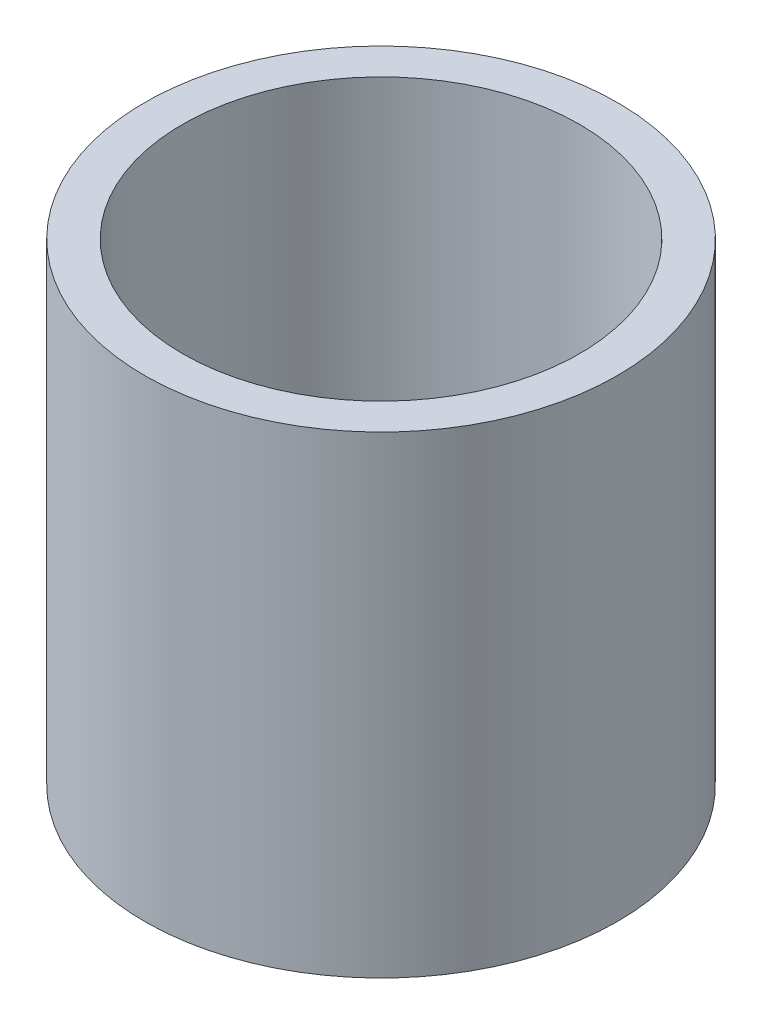
ISO-10303-21;
HEADER;
FILE_DESCRIPTION(('STEP AP214'),'2;1');
FILE_NAME('part.step','',(''),(''),'','','');
FILE_SCHEMA(('AUTOMOTIVE_DESIGN { 1 0 10303 214 1 1 1 1 }'));
ENDSEC;
DATA;
#1=APPLICATION_CONTEXT('core data for automotive mechanical design processes');
#2=APPLICATION_PROTOCOL_DEFINITION('international standard','automotive_design',2000,#1);
#3=PRODUCT_CONTEXT('',#1,'mechanical');
#4=PRODUCT('Part','Part','',(#3));
#5=PRODUCT_RELATED_PRODUCT_CATEGORY('part','',(#4));
#6=PRODUCT_DEFINITION_FORMATION('','',#4);
#7=PRODUCT_DEFINITION_CONTEXT('part definition',#1,'design');
#8=PRODUCT_DEFINITION('design','',#6,#7);
#9=PRODUCT_DEFINITION_SHAPE('','',#8);
#10=(LENGTH_UNIT() NAMED_UNIT(*) SI_UNIT(.MILLI.,.METRE.));
#11=(NAMED_UNIT(*) PLANE_ANGLE_UNIT() SI_UNIT($,.RADIAN.));
#12=(NAMED_UNIT(*) SI_UNIT($,.STERADIAN.) SOLID_ANGLE_UNIT());
#13=UNCERTAINTY_MEASURE_WITH_UNIT(LENGTH_MEASURE(1.E-05),#10,'distance_accuracy_value','');
#14=(GEOMETRIC_REPRESENTATION_CONTEXT(3) GLOBAL_UNCERTAINTY_ASSIGNED_CONTEXT((#13)) GLOBAL_UNIT_ASSIGNED_CONTEXT((#10,
#11,#12)) REPRESENTATION_CONTEXT('',''));
#15=CARTESIAN_POINT('',(0.,0.,0.));
#16=DIRECTION('',(0.,0.,1.));
#17=DIRECTION('',(1.,0.,0.));
#18=AXIS2_PLACEMENT_3D('',#15,#16,#17);
#19=CARTESIAN_POINT('',(0.,50.,0.));
#20=DIRECTION('',(0.,1.,0.));
#21=DIRECTION('',(0.,0.,1.));
#22=AXIS2_PLACEMENT_3D('',#19,#20,#21);
#23=PLANE('',#22);
#24=CARTESIAN_POINT('',(0.,50.,0.));
#25=DIRECTION('',(0.,1.,0.));
#26=DIRECTION('',(1.,0.,0.));
#27=AXIS2_PLACEMENT_3D('',#24,#25,#26);
#28=CIRCLE('',#27,25.);
#29=CARTESIAN_POINT('',(25.,50.,0.));
#30=VERTEX_POINT('',#29);
#31=EDGE_CURVE('E51',#30,#30,#28,.T.);
#32=ORIENTED_EDGE('',*,*,#31,.T.);
#33=EDGE_LOOP('',(#32));
#34=FACE_BOUND('',#33,.T.);
#35=CARTESIAN_POINT('',(0.,50.,0.));
#36=DIRECTION('',(0.,1.,0.));
#37=DIRECTION('',(0.,0.,1.));
#38=AXIS2_PLACEMENT_3D('',#35,#36,#37);
#39=CIRCLE('',#38,21.);
#40=CARTESIAN_POINT('',(0.,50.,21.));
#41=VERTEX_POINT('',#40);
#42=EDGE_CURVE('E62',#41,#41,#39,.T.);
#43=ORIENTED_EDGE('',*,*,#42,.F.);
#44=EDGE_LOOP('',(#43));
#45=FACE_BOUND('',#44,.T.);
#46=ADVANCED_FACE('F43',(#34,#45),#23,.T.);
#47=CARTESIAN_POINT('',(0.,0.,0.));
#48=DIRECTION('',(0.,1.,0.));
#49=DIRECTION('',(0.,0.,1.));
#50=AXIS2_PLACEMENT_3D('',#47,#48,#49);
#51=PLANE('',#50);
#52=CARTESIAN_POINT('',(0.,0.,0.));
#53=DIRECTION('',(0.,1.,0.));
#54=DIRECTION('',(1.,0.,0.));
#55=AXIS2_PLACEMENT_3D('',#52,#53,#54);
#56=CIRCLE('',#55,25.);
#57=CARTESIAN_POINT('',(25.,0.,0.));
#58=VERTEX_POINT('',#57);
#59=EDGE_CURVE('E56',#58,#58,#56,.T.);
#60=ORIENTED_EDGE('',*,*,#59,.F.);
#61=EDGE_LOOP('',(#60));
#62=FACE_BOUND('',#61,.T.);
#63=ADVANCED_FACE('F71',(#62),#51,.F.);
#64=CARTESIAN_POINT('',(0.,50.,0.));
#65=DIRECTION('',(0.,-1.,0.));
#66=DIRECTION('',(0.,0.,-1.));
#67=AXIS2_PLACEMENT_3D('',#64,#65,#66);
#68=CYLINDRICAL_SURFACE('',#67,25.);
#69=ORIENTED_EDGE('',*,*,#31,.F.);
#70=EDGE_LOOP('',(#69));
#71=FACE_BOUND('',#70,.T.);
#72=ORIENTED_EDGE('',*,*,#59,.T.);
#73=EDGE_LOOP('',(#72));
#74=FACE_BOUND('',#73,.T.);
#75=ADVANCED_FACE('F45',(#71,#74),#68,.T.);
#76=CARTESIAN_POINT('',(0.,50.,0.));
#77=DIRECTION('',(0.,-1.,0.));
#78=DIRECTION('',(0.,0.,-1.));
#79=AXIS2_PLACEMENT_3D('',#76,#77,#78);
#80=CYLINDRICAL_SURFACE('',#79,21.);
#81=CARTESIAN_POINT('',(0.,4.,0.));
#82=DIRECTION('',(0.,1.,0.));
#83=DIRECTION('',(0.,0.,1.));
#84=AXIS2_PLACEMENT_3D('',#81,#82,#83);
#85=CIRCLE('',#84,21.);
#86=CARTESIAN_POINT('',(0.,4.,21.));
#87=VERTEX_POINT('',#86);
#88=EDGE_CURVE('E11',#87,#87,#85,.T.);
#89=ORIENTED_EDGE('',*,*,#88,.F.);
#90=EDGE_LOOP('',(#89));
#91=FACE_BOUND('',#90,.T.);
#92=ORIENTED_EDGE('',*,*,#42,.T.);
#93=EDGE_LOOP('',(#92));
#94=FACE_BOUND('',#93,.T.);
#95=ADVANCED_FACE('F68',(#91,#94),#80,.F.);
#96=CARTESIAN_POINT('',(0.,4.,0.));
#97=DIRECTION('',(0.,1.,0.));
#98=DIRECTION('',(0.,0.,1.));
#99=AXIS2_PLACEMENT_3D('',#96,#97,#98);
#100=PLANE('',#99);
#101=ORIENTED_EDGE('',*,*,#88,.T.);
#102=EDGE_LOOP('',(#101));
#103=FACE_BOUND('',#102,.T.);
#104=ADVANCED_FACE('F80',(#103),#100,.T.);
#105=CLOSED_SHELL('',(#46,#63,#75,#95,#104));
#106=MANIFOLD_SOLID_BREP('B2',#105);
#107=ADVANCED_BREP_SHAPE_REPRESENTATION('',(#18,#106),#14);
#108=SHAPE_DEFINITION_REPRESENTATION(#9,#107);
ENDSEC;
END-ISO-10303-21;
